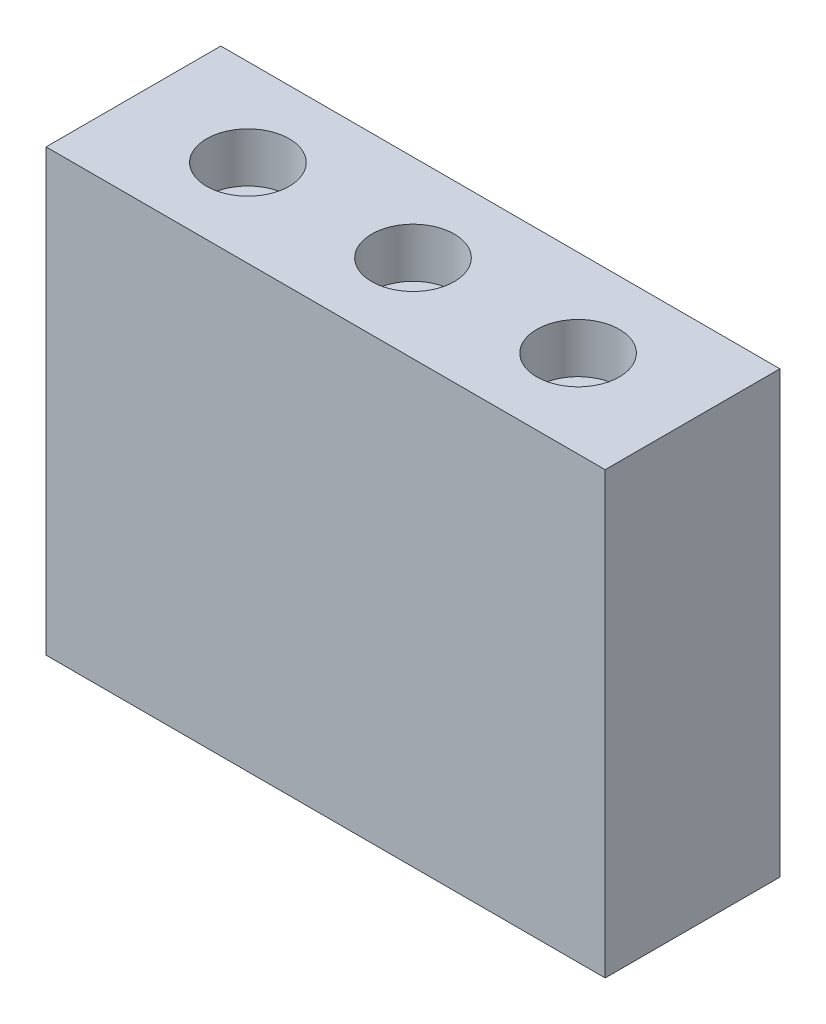
ISO-10303-21;
HEADER;
FILE_DESCRIPTION(('STEP AP214'),'2;1');
FILE_NAME('part.step','',(''),(''),'','','');
FILE_SCHEMA(('AUTOMOTIVE_DESIGN { 1 0 10303 214 1 1 1 1 }'));
ENDSEC;
DATA;
#1=APPLICATION_CONTEXT('core data for automotive mechanical design processes');
#2=APPLICATION_PROTOCOL_DEFINITION('international standard','automotive_design',2000,#1);
#3=PRODUCT_CONTEXT('',#1,'mechanical');
#4=PRODUCT('Part','Part','',(#3));
#5=PRODUCT_RELATED_PRODUCT_CATEGORY('part','',(#4));
#6=PRODUCT_DEFINITION_FORMATION('','',#4);
#7=PRODUCT_DEFINITION_CONTEXT('part definition',#1,'design');
#8=PRODUCT_DEFINITION('design','',#6,#7);
#9=PRODUCT_DEFINITION_SHAPE('','',#8);
#10=(LENGTH_UNIT() NAMED_UNIT(*) SI_UNIT(.MILLI.,.METRE.));
#11=(NAMED_UNIT(*) PLANE_ANGLE_UNIT() SI_UNIT($,.RADIAN.));
#12=(NAMED_UNIT(*) SI_UNIT($,.STERADIAN.) SOLID_ANGLE_UNIT());
#13=UNCERTAINTY_MEASURE_WITH_UNIT(LENGTH_MEASURE(1.E-05),#10,'distance_accuracy_value','');
#14=(GEOMETRIC_REPRESENTATION_CONTEXT(3) GLOBAL_UNCERTAINTY_ASSIGNED_CONTEXT((#13)) GLOBAL_UNIT_ASSIGNED_CONTEXT((#10,
#11,#12)) REPRESENTATION_CONTEXT('',''));
#15=CARTESIAN_POINT('',(0.,0.,0.));
#16=DIRECTION('',(0.,0.,1.));
#17=DIRECTION('',(1.,0.,0.));
#18=AXIS2_PLACEMENT_3D('',#15,#16,#17);
#19=CARTESIAN_POINT('',(-50.8,80.,15.875));
#20=DIRECTION('',(1.,0.,0.));
#21=DIRECTION('',(0.,0.,-1.));
#22=AXIS2_PLACEMENT_3D('',#19,#20,#21);
#23=PLANE('',#22);
#24=DIRECTION('',(0.,-1.,0.));
#25=VECTOR('',#24,1.);
#26=CARTESIAN_POINT('',(-50.8,80.,-15.875));
#27=LINE('',#26,#25);
#28=CARTESIAN_POINT('',(-50.8,80.,-15.875));
#29=VERTEX_POINT('',#28);
#30=CARTESIAN_POINT('',(-50.8,0.,-15.875));
#31=VERTEX_POINT('',#30);
#32=EDGE_CURVE('E82',#29,#31,#27,.T.);
#33=ORIENTED_EDGE('',*,*,#32,.T.);
#34=DIRECTION('',(0.,0.,1.));
#35=VECTOR('',#34,1.);
#36=CARTESIAN_POINT('',(-50.8,0.,-15.875));
#37=LINE('',#36,#35);
#38=CARTESIAN_POINT('',(-50.8,0.,15.875));
#39=VERTEX_POINT('',#38);
#40=EDGE_CURVE('E48',#31,#39,#37,.T.);
#41=ORIENTED_EDGE('',*,*,#40,.T.);
#42=DIRECTION('',(0.,-1.,0.));
#43=VECTOR('',#42,1.);
#44=CARTESIAN_POINT('',(-50.8,80.,15.875));
#45=LINE('',#44,#43);
#46=CARTESIAN_POINT('',(-50.8,80.,15.875));
#47=VERTEX_POINT('',#46);
#48=EDGE_CURVE('E77',#47,#39,#45,.T.);
#49=ORIENTED_EDGE('',*,*,#48,.F.);
#50=DIRECTION('',(0.,0.,-1.));
#51=VECTOR('',#50,1.);
#52=CARTESIAN_POINT('',(-50.8,80.,15.875));
#53=LINE('',#52,#51);
#54=EDGE_CURVE('E41',#47,#29,#53,.T.);
#55=ORIENTED_EDGE('',*,*,#54,.T.);
#56=EDGE_LOOP('',(#33,#41,#49,#55));
#57=FACE_BOUND('',#56,.T.);
#58=ADVANCED_FACE('F34',(#57),#23,.F.);
#59=CARTESIAN_POINT('',(50.8,80.,15.875));
#60=DIRECTION('',(-1.,0.,0.));
#61=DIRECTION('',(0.,0.,1.));
#62=AXIS2_PLACEMENT_3D('',#59,#60,#61);
#63=PLANE('',#62);
#64=DIRECTION('',(0.,1.,0.));
#65=VECTOR('',#64,1.);
#66=CARTESIAN_POINT('',(50.8,80.,15.875));
#67=LINE('',#66,#65);
#68=CARTESIAN_POINT('',(50.8,0.,15.875));
#69=VERTEX_POINT('',#68);
#70=CARTESIAN_POINT('',(50.8,80.,15.875));
#71=VERTEX_POINT('',#70);
#72=EDGE_CURVE('E91',#69,#71,#67,.T.);
#73=ORIENTED_EDGE('',*,*,#72,.F.);
#74=DIRECTION('',(0.,0.,1.));
#75=VECTOR('',#74,1.);
#76=CARTESIAN_POINT('',(50.8,0.,-15.875));
#77=LINE('',#76,#75);
#78=CARTESIAN_POINT('',(50.8,0.,-15.875));
#79=VERTEX_POINT('',#78);
#80=EDGE_CURVE('E87',#79,#69,#77,.T.);
#81=ORIENTED_EDGE('',*,*,#80,.F.);
#82=DIRECTION('',(0.,1.,0.));
#83=VECTOR('',#82,1.);
#84=CARTESIAN_POINT('',(50.8,80.,-15.875));
#85=LINE('',#84,#83);
#86=CARTESIAN_POINT('',(50.8,80.,-15.875));
#87=VERTEX_POINT('',#86);
#88=EDGE_CURVE('E78',#79,#87,#85,.T.);
#89=ORIENTED_EDGE('',*,*,#88,.T.);
#90=DIRECTION('',(0.,0.,-1.));
#91=VECTOR('',#90,1.);
#92=CARTESIAN_POINT('',(50.8,80.,15.875));
#93=LINE('',#92,#91);
#94=EDGE_CURVE('E11',#71,#87,#93,.T.);
#95=ORIENTED_EDGE('',*,*,#94,.F.);
#96=EDGE_LOOP('',(#73,#81,#89,#95));
#97=FACE_BOUND('',#96,.T.);
#98=ADVANCED_FACE('F141',(#97),#63,.F.);
#99=CARTESIAN_POINT('',(-50.8,80.,15.875));
#100=DIRECTION('',(0.,-1.,0.));
#101=DIRECTION('',(0.,0.,-1.));
#102=AXIS2_PLACEMENT_3D('',#99,#100,#101);
#103=PLANE('',#102);
#104=CARTESIAN_POINT('',(30.,80.,0.));
#105=DIRECTION('',(0.,1.,0.));
#106=DIRECTION('',(0.,0.,1.));
#107=AXIS2_PLACEMENT_3D('',#104,#105,#106);
#108=CIRCLE('',#107,7.5);
#109=CARTESIAN_POINT('',(30.,80.,7.49999999999999));
#110=VERTEX_POINT('',#109);
#111=EDGE_CURVE('E132',#110,#110,#108,.T.);
#112=ORIENTED_EDGE('',*,*,#111,.F.);
#113=EDGE_LOOP('',(#112));
#114=FACE_BOUND('',#113,.T.);
#115=CARTESIAN_POINT('',(0.,80.,0.));
#116=DIRECTION('',(0.,1.,0.));
#117=DIRECTION('',(0.,0.,1.));
#118=AXIS2_PLACEMENT_3D('',#115,#116,#117);
#119=CIRCLE('',#118,7.5);
#120=CARTESIAN_POINT('',(0.,80.,7.5));
#121=VERTEX_POINT('',#120);
#122=EDGE_CURVE('E120',#121,#121,#119,.T.);
#123=ORIENTED_EDGE('',*,*,#122,.F.);
#124=EDGE_LOOP('',(#123));
#125=FACE_BOUND('',#124,.T.);
#126=CARTESIAN_POINT('',(-30.,80.,0.));
#127=DIRECTION('',(0.,1.,0.));
#128=DIRECTION('',(0.,0.,1.));
#129=AXIS2_PLACEMENT_3D('',#126,#127,#128);
#130=CIRCLE('',#129,7.5);
#131=CARTESIAN_POINT('',(-30.,80.,7.5));
#132=VERTEX_POINT('',#131);
#133=EDGE_CURVE('E108',#132,#132,#130,.T.);
#134=ORIENTED_EDGE('',*,*,#133,.F.);
#135=EDGE_LOOP('',(#134));
#136=FACE_BOUND('',#135,.T.);
#137=DIRECTION('',(-1.,0.,0.));
#138=VECTOR('',#137,1.);
#139=CARTESIAN_POINT('',(-50.8,80.,-15.875));
#140=LINE('',#139,#138);
#141=EDGE_CURVE('E69',#87,#29,#140,.T.);
#142=ORIENTED_EDGE('',*,*,#141,.T.);
#143=ORIENTED_EDGE('',*,*,#54,.F.);
#144=DIRECTION('',(-1.,0.,0.));
#145=VECTOR('',#144,1.);
#146=CARTESIAN_POINT('',(-50.8,80.,15.875));
#147=LINE('',#146,#145);
#148=EDGE_CURVE('E57',#71,#47,#147,.T.);
#149=ORIENTED_EDGE('',*,*,#148,.F.);
#150=ORIENTED_EDGE('',*,*,#94,.T.);
#151=EDGE_LOOP('',(#142,#143,#149,#150));
#152=FACE_BOUND('',#151,.T.);
#153=ADVANCED_FACE('F71',(#114,#125,#136,#152),#103,.F.);
#154=CARTESIAN_POINT('',(0.,0.,15.875));
#155=DIRECTION('',(0.,0.,1.));
#156=DIRECTION('',(1.,0.,0.));
#157=AXIS2_PLACEMENT_3D('',#154,#155,#156);
#158=PLANE('',#157);
#159=DIRECTION('',(-1.,0.,0.));
#160=VECTOR('',#159,1.);
#161=CARTESIAN_POINT('',(-50.8,0.,15.875));
#162=LINE('',#161,#160);
#163=EDGE_CURVE('E96',#69,#39,#162,.T.);
#164=ORIENTED_EDGE('',*,*,#163,.F.);
#165=ORIENTED_EDGE('',*,*,#72,.T.);
#166=ORIENTED_EDGE('',*,*,#148,.T.);
#167=ORIENTED_EDGE('',*,*,#48,.T.);
#168=EDGE_LOOP('',(#164,#165,#166,#167));
#169=FACE_BOUND('',#168,.T.);
#170=ADVANCED_FACE('F140',(#169),#158,.T.);
#171=CARTESIAN_POINT('',(0.,0.,-15.875));
#172=DIRECTION('',(0.,0.,1.));
#173=DIRECTION('',(1.,0.,0.));
#174=AXIS2_PLACEMENT_3D('',#171,#172,#173);
#175=PLANE('',#174);
#176=ORIENTED_EDGE('',*,*,#88,.F.);
#177=DIRECTION('',(-1.,0.,0.));
#178=VECTOR('',#177,1.);
#179=CARTESIAN_POINT('',(-50.8,0.,-15.875));
#180=LINE('',#179,#178);
#181=EDGE_CURVE('E84',#79,#31,#180,.T.);
#182=ORIENTED_EDGE('',*,*,#181,.T.);
#183=ORIENTED_EDGE('',*,*,#32,.F.);
#184=ORIENTED_EDGE('',*,*,#141,.F.);
#185=EDGE_LOOP('',(#176,#182,#183,#184));
#186=FACE_BOUND('',#185,.T.);
#187=ADVANCED_FACE('F83',(#186),#175,.F.);
#188=CARTESIAN_POINT('',(-50.8,0.,-15.875));
#189=DIRECTION('',(0.,1.,0.));
#190=DIRECTION('',(0.,0.,1.));
#191=AXIS2_PLACEMENT_3D('',#188,#189,#190);
#192=PLANE('',#191);
#193=CARTESIAN_POINT('',(30.,0.,0.));
#194=DIRECTION('',(0.,1.,0.));
#195=DIRECTION('',(0.,0.,1.));
#196=AXIS2_PLACEMENT_3D('',#193,#194,#195);
#197=CIRCLE('',#196,4.49999999999998);
#198=CARTESIAN_POINT('',(30.,0.,4.49999999999997));
#199=VERTEX_POINT('',#198);
#200=EDGE_CURVE('E123',#199,#199,#197,.T.);
#201=ORIENTED_EDGE('',*,*,#200,.T.);
#202=EDGE_LOOP('',(#201));
#203=FACE_BOUND('',#202,.T.);
#204=CARTESIAN_POINT('',(0.,0.,0.));
#205=DIRECTION('',(0.,1.,0.));
#206=DIRECTION('',(0.,0.,1.));
#207=AXIS2_PLACEMENT_3D('',#204,#205,#206);
#208=CIRCLE('',#207,4.49999999999998);
#209=CARTESIAN_POINT('',(0.,0.,4.49999999999998));
#210=VERTEX_POINT('',#209);
#211=EDGE_CURVE('E111',#210,#210,#208,.T.);
#212=ORIENTED_EDGE('',*,*,#211,.T.);
#213=EDGE_LOOP('',(#212));
#214=FACE_BOUND('',#213,.T.);
#215=CARTESIAN_POINT('',(-30.,0.,0.));
#216=DIRECTION('',(0.,1.,0.));
#217=DIRECTION('',(0.,0.,1.));
#218=AXIS2_PLACEMENT_3D('',#215,#216,#217);
#219=CIRCLE('',#218,4.49999999999998);
#220=CARTESIAN_POINT('',(-30.,0.,4.49999999999998));
#221=VERTEX_POINT('',#220);
#222=EDGE_CURVE('E98',#221,#221,#219,.T.);
#223=ORIENTED_EDGE('',*,*,#222,.T.);
#224=EDGE_LOOP('',(#223));
#225=FACE_BOUND('',#224,.T.);
#226=ORIENTED_EDGE('',*,*,#163,.T.);
#227=ORIENTED_EDGE('',*,*,#40,.F.);
#228=ORIENTED_EDGE('',*,*,#181,.F.);
#229=ORIENTED_EDGE('',*,*,#80,.T.);
#230=EDGE_LOOP('',(#226,#227,#228,#229));
#231=FACE_BOUND('',#230,.T.);
#232=ADVANCED_FACE('F175',(#203,#214,#225,#231),#192,.F.);
#233=CARTESIAN_POINT('',(-30.,80.,0.));
#234=DIRECTION('',(0.,1.,0.));
#235=DIRECTION('',(0.,0.,1.));
#236=AXIS2_PLACEMENT_3D('',#233,#234,#235);
#237=CYLINDRICAL_SURFACE('',#236,4.5);
#238=ORIENTED_EDGE('',*,*,#222,.F.);
#239=EDGE_LOOP('',(#238));
#240=FACE_BOUND('',#239,.T.);
#241=CARTESIAN_POINT('',(-30.,71.,0.));
#242=DIRECTION('',(0.,1.,0.));
#243=DIRECTION('',(0.,0.,1.));
#244=AXIS2_PLACEMENT_3D('',#241,#242,#243);
#245=CIRCLE('',#244,4.50000000000001);
#246=CARTESIAN_POINT('',(-30.,71.,4.50000000000001));
#247=VERTEX_POINT('',#246);
#248=EDGE_CURVE('E102',#247,#247,#245,.T.);
#249=ORIENTED_EDGE('',*,*,#248,.T.);
#250=EDGE_LOOP('',(#249));
#251=FACE_BOUND('',#250,.T.);
#252=ADVANCED_FACE('F160',(#240,#251),#237,.F.);
#253=CARTESIAN_POINT('',(-25.5,71.,0.));
#254=DIRECTION('',(0.,-1.,0.));
#255=DIRECTION('',(0.,0.,-1.));
#256=AXIS2_PLACEMENT_3D('',#253,#254,#255);
#257=PLANE('',#256);
#258=ORIENTED_EDGE('',*,*,#248,.F.);
#259=EDGE_LOOP('',(#258));
#260=FACE_BOUND('',#259,.T.);
#261=CARTESIAN_POINT('',(-30.,71.,0.));
#262=DIRECTION('',(0.,1.,0.));
#263=DIRECTION('',(0.,0.,1.));
#264=AXIS2_PLACEMENT_3D('',#261,#262,#263);
#265=CIRCLE('',#264,7.5);
#266=CARTESIAN_POINT('',(-30.,71.,7.5));
#267=VERTEX_POINT('',#266);
#268=EDGE_CURVE('E105',#267,#267,#265,.T.);
#269=ORIENTED_EDGE('',*,*,#268,.T.);
#270=EDGE_LOOP('',(#269));
#271=FACE_BOUND('',#270,.T.);
#272=ADVANCED_FACE('F150',(#260,#271),#257,.F.);
#273=CARTESIAN_POINT('',(-30.,80.,0.));
#274=DIRECTION('',(0.,1.,0.));
#275=DIRECTION('',(0.,0.,1.));
#276=AXIS2_PLACEMENT_3D('',#273,#274,#275);
#277=CYLINDRICAL_SURFACE('',#276,7.5);
#278=ORIENTED_EDGE('',*,*,#268,.F.);
#279=EDGE_LOOP('',(#278));
#280=FACE_BOUND('',#279,.T.);
#281=ORIENTED_EDGE('',*,*,#133,.T.);
#282=EDGE_LOOP('',(#281));
#283=FACE_BOUND('',#282,.T.);
#284=ADVANCED_FACE('F147',(#280,#283),#277,.F.);
#285=CARTESIAN_POINT('',(0.,80.,0.));
#286=DIRECTION('',(0.,1.,0.));
#287=DIRECTION('',(0.,0.,1.));
#288=AXIS2_PLACEMENT_3D('',#285,#286,#287);
#289=CYLINDRICAL_SURFACE('',#288,4.49999999999999);
#290=ORIENTED_EDGE('',*,*,#211,.F.);
#291=EDGE_LOOP('',(#290));
#292=FACE_BOUND('',#291,.T.);
#293=CARTESIAN_POINT('',(0.,71.,0.));
#294=DIRECTION('',(0.,1.,0.));
#295=DIRECTION('',(0.,0.,1.));
#296=AXIS2_PLACEMENT_3D('',#293,#294,#295);
#297=CIRCLE('',#296,4.50000000000001);
#298=CARTESIAN_POINT('',(0.,71.,4.50000000000001));
#299=VERTEX_POINT('',#298);
#300=EDGE_CURVE('E114',#299,#299,#297,.T.);
#301=ORIENTED_EDGE('',*,*,#300,.T.);
#302=EDGE_LOOP('',(#301));
#303=FACE_BOUND('',#302,.T.);
#304=ADVANCED_FACE('F149',(#292,#303),#289,.F.);
#305=CARTESIAN_POINT('',(4.50000000000001,71.,0.));
#306=DIRECTION('',(0.,-1.,0.));
#307=DIRECTION('',(0.,0.,-1.));
#308=AXIS2_PLACEMENT_3D('',#305,#306,#307);
#309=PLANE('',#308);
#310=ORIENTED_EDGE('',*,*,#300,.F.);
#311=EDGE_LOOP('',(#310));
#312=FACE_BOUND('',#311,.T.);
#313=CARTESIAN_POINT('',(0.,71.,0.));
#314=DIRECTION('',(0.,1.,0.));
#315=DIRECTION('',(0.,0.,1.));
#316=AXIS2_PLACEMENT_3D('',#313,#314,#315);
#317=CIRCLE('',#316,7.5);
#318=CARTESIAN_POINT('',(0.,71.,7.5));
#319=VERTEX_POINT('',#318);
#320=EDGE_CURVE('E117',#319,#319,#317,.T.);
#321=ORIENTED_EDGE('',*,*,#320,.T.);
#322=EDGE_LOOP('',(#321));
#323=FACE_BOUND('',#322,.T.);
#324=ADVANCED_FACE('F157',(#312,#323),#309,.F.);
#325=CARTESIAN_POINT('',(0.,80.,0.));
#326=DIRECTION('',(0.,1.,0.));
#327=DIRECTION('',(0.,0.,1.));
#328=AXIS2_PLACEMENT_3D('',#325,#326,#327);
#329=CYLINDRICAL_SURFACE('',#328,7.5);
#330=ORIENTED_EDGE('',*,*,#320,.F.);
#331=EDGE_LOOP('',(#330));
#332=FACE_BOUND('',#331,.T.);
#333=ORIENTED_EDGE('',*,*,#122,.T.);
#334=EDGE_LOOP('',(#333));
#335=FACE_BOUND('',#334,.T.);
#336=ADVANCED_FACE('F221',(#332,#335),#329,.F.);
#337=CARTESIAN_POINT('',(30.,80.,0.));
#338=DIRECTION('',(0.,1.,0.));
#339=DIRECTION('',(0.,0.,1.));
#340=AXIS2_PLACEMENT_3D('',#337,#338,#339);
#341=CYLINDRICAL_SURFACE('',#340,4.49999999999999);
#342=ORIENTED_EDGE('',*,*,#200,.F.);
#343=EDGE_LOOP('',(#342));
#344=FACE_BOUND('',#343,.T.);
#345=CARTESIAN_POINT('',(30.,71.,0.));
#346=DIRECTION('',(0.,1.,0.));
#347=DIRECTION('',(0.,0.,1.));
#348=AXIS2_PLACEMENT_3D('',#345,#346,#347);
#349=CIRCLE('',#348,4.5);
#350=CARTESIAN_POINT('',(30.,71.,4.49999999999999));
#351=VERTEX_POINT('',#350);
#352=EDGE_CURVE('E126',#351,#351,#349,.T.);
#353=ORIENTED_EDGE('',*,*,#352,.T.);
#354=EDGE_LOOP('',(#353));
#355=FACE_BOUND('',#354,.T.);
#356=ADVANCED_FACE('F231',(#344,#355),#341,.F.);
#357=CARTESIAN_POINT('',(34.5,71.,0.));
#358=DIRECTION('',(0.,-1.,0.));
#359=DIRECTION('',(0.,0.,-1.));
#360=AXIS2_PLACEMENT_3D('',#357,#358,#359);
#361=PLANE('',#360);
#362=ORIENTED_EDGE('',*,*,#352,.F.);
#363=EDGE_LOOP('',(#362));
#364=FACE_BOUND('',#363,.T.);
#365=CARTESIAN_POINT('',(30.,71.,0.));
#366=DIRECTION('',(0.,1.,0.));
#367=DIRECTION('',(0.,0.,1.));
#368=AXIS2_PLACEMENT_3D('',#365,#366,#367);
#369=CIRCLE('',#368,7.5);
#370=CARTESIAN_POINT('',(30.,71.,7.49999999999999));
#371=VERTEX_POINT('',#370);
#372=EDGE_CURVE('E129',#371,#371,#369,.T.);
#373=ORIENTED_EDGE('',*,*,#372,.T.);
#374=EDGE_LOOP('',(#373));
#375=FACE_BOUND('',#374,.T.);
#376=ADVANCED_FACE('F241',(#364,#375),#361,.F.);
#377=CARTESIAN_POINT('',(30.,80.,0.));
#378=DIRECTION('',(0.,1.,0.));
#379=DIRECTION('',(0.,0.,1.));
#380=AXIS2_PLACEMENT_3D('',#377,#378,#379);
#381=CYLINDRICAL_SURFACE('',#380,7.5);
#382=ORIENTED_EDGE('',*,*,#372,.F.);
#383=EDGE_LOOP('',(#382));
#384=FACE_BOUND('',#383,.T.);
#385=ORIENTED_EDGE('',*,*,#111,.T.);
#386=EDGE_LOOP('',(#385));
#387=FACE_BOUND('',#386,.T.);
#388=ADVANCED_FACE('F136',(#384,#387),#381,.F.);
#389=CLOSED_SHELL('',(#58,#98,#153,#170,#187,#232,#252,#272,#284,#304,#324,#336,#356,#376,#388));
#390=MANIFOLD_SOLID_BREP('B2',#389);
#391=ADVANCED_BREP_SHAPE_REPRESENTATION('',(#18,#390),#14);
#392=SHAPE_DEFINITION_REPRESENTATION(#9,#391);
ENDSEC;
END-ISO-10303-21;
